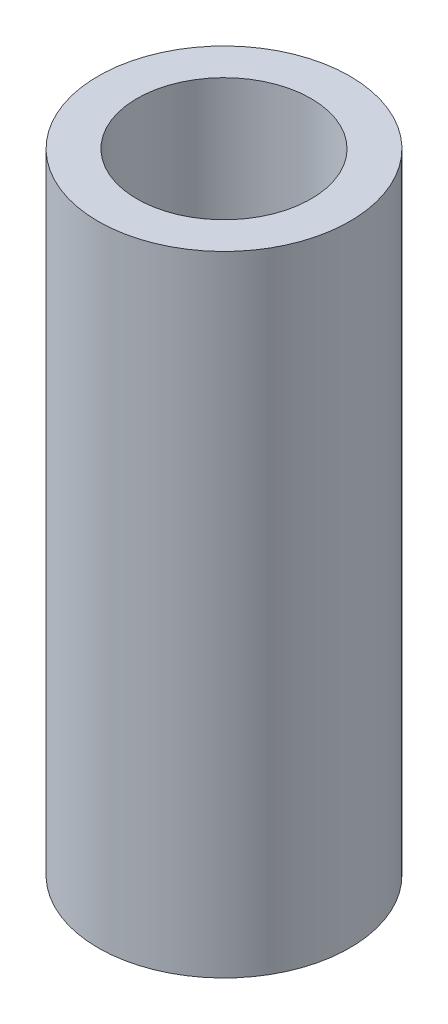
ISO-10303-21;
HEADER;
FILE_DESCRIPTION(('STEP AP214'),'2;1');
FILE_NAME('part.step','',(''),(''),'','','');
FILE_SCHEMA(('AUTOMOTIVE_DESIGN { 1 0 10303 214 1 1 1 1 }'));
ENDSEC;
DATA;
#1=APPLICATION_CONTEXT('core data for automotive mechanical design processes');
#2=APPLICATION_PROTOCOL_DEFINITION('international standard','automotive_design',2000,#1);
#3=PRODUCT_CONTEXT('',#1,'mechanical');
#4=PRODUCT('Part','Part','',(#3));
#5=PRODUCT_RELATED_PRODUCT_CATEGORY('part','',(#4));
#6=PRODUCT_DEFINITION_FORMATION('','',#4);
#7=PRODUCT_DEFINITION_CONTEXT('part definition',#1,'design');
#8=PRODUCT_DEFINITION('design','',#6,#7);
#9=PRODUCT_DEFINITION_SHAPE('','',#8);
#10=(LENGTH_UNIT() NAMED_UNIT(*) SI_UNIT(.MILLI.,.METRE.));
#11=(NAMED_UNIT(*) PLANE_ANGLE_UNIT() SI_UNIT($,.RADIAN.));
#12=(NAMED_UNIT(*) SI_UNIT($,.STERADIAN.) SOLID_ANGLE_UNIT());
#13=UNCERTAINTY_MEASURE_WITH_UNIT(LENGTH_MEASURE(1.E-05),#10,'distance_accuracy_value','');
#14=(GEOMETRIC_REPRESENTATION_CONTEXT(3) GLOBAL_UNCERTAINTY_ASSIGNED_CONTEXT((#13)) GLOBAL_UNIT_ASSIGNED_CONTEXT((#10,
#11,#12)) REPRESENTATION_CONTEXT('',''));
#15=CARTESIAN_POINT('',(0.,0.,0.));
#16=DIRECTION('',(0.,0.,1.));
#17=DIRECTION('',(1.,0.,0.));
#18=AXIS2_PLACEMENT_3D('',#15,#16,#17);
#19=CARTESIAN_POINT('',(0.,30.,0.));
#20=DIRECTION('',(0.,-1.,0.));
#21=DIRECTION('',(0.,0.,-1.));
#22=AXIS2_PLACEMENT_3D('',#19,#20,#21);
#23=CYLINDRICAL_SURFACE('',#22,4.15);
#24=CARTESIAN_POINT('',(0.,0.,0.));
#25=DIRECTION('',(0.,-1.,0.));
#26=DIRECTION('',(0.,0.,-1.));
#27=AXIS2_PLACEMENT_3D('',#24,#25,#26);
#28=CIRCLE('',#27,4.15);
#29=CARTESIAN_POINT('',(0.,0.,-4.15));
#30=VERTEX_POINT('',#29);
#31=EDGE_CURVE('E31',#30,#30,#28,.T.);
#32=ORIENTED_EDGE('',*,*,#31,.T.);
#33=EDGE_LOOP('',(#32));
#34=FACE_BOUND('',#33,.T.);
#35=CARTESIAN_POINT('',(0.,30.,0.));
#36=DIRECTION('',(0.,-1.,0.));
#37=DIRECTION('',(0.,0.,-1.));
#38=AXIS2_PLACEMENT_3D('',#35,#36,#37);
#39=CIRCLE('',#38,4.15);
#40=CARTESIAN_POINT('',(0.,30.,-4.15));
#41=VERTEX_POINT('',#40);
#42=EDGE_CURVE('E40',#41,#41,#39,.T.);
#43=ORIENTED_EDGE('',*,*,#42,.F.);
#44=EDGE_LOOP('',(#43));
#45=FACE_BOUND('',#44,.T.);
#46=ADVANCED_FACE('F15',(#34,#45),#23,.F.);
#47=CARTESIAN_POINT('',(0.,30.,0.));
#48=DIRECTION('',(0.,1.,0.));
#49=DIRECTION('',(0.,0.,1.));
#50=AXIS2_PLACEMENT_3D('',#47,#48,#49);
#51=PLANE('',#50);
#52=ORIENTED_EDGE('',*,*,#42,.T.);
#53=EDGE_LOOP('',(#52));
#54=FACE_BOUND('',#53,.T.);
#55=CARTESIAN_POINT('',(0.,30.,0.));
#56=DIRECTION('',(0.,-1.,0.));
#57=DIRECTION('',(0.,0.,-1.));
#58=AXIS2_PLACEMENT_3D('',#55,#56,#57);
#59=CIRCLE('',#58,6.);
#60=CARTESIAN_POINT('',(0.,30.,-6.));
#61=VERTEX_POINT('',#60);
#62=EDGE_CURVE('E23',#61,#61,#59,.T.);
#63=ORIENTED_EDGE('',*,*,#62,.F.);
#64=EDGE_LOOP('',(#63));
#65=FACE_BOUND('',#64,.T.);
#66=ADVANCED_FACE('F46',(#54,#65),#51,.T.);
#67=CARTESIAN_POINT('',(0.,0.,0.));
#68=DIRECTION('',(0.,1.,0.));
#69=DIRECTION('',(0.,0.,1.));
#70=AXIS2_PLACEMENT_3D('',#67,#68,#69);
#71=PLANE('',#70);
#72=ORIENTED_EDGE('',*,*,#31,.F.);
#73=EDGE_LOOP('',(#72));
#74=FACE_BOUND('',#73,.T.);
#75=CARTESIAN_POINT('',(0.,0.,0.));
#76=DIRECTION('',(0.,-1.,0.));
#77=DIRECTION('',(0.,0.,-1.));
#78=AXIS2_PLACEMENT_3D('',#75,#76,#77);
#79=CIRCLE('',#78,6.);
#80=CARTESIAN_POINT('',(0.,0.,-6.));
#81=VERTEX_POINT('',#80);
#82=EDGE_CURVE('E10',#81,#81,#79,.F.);
#83=ORIENTED_EDGE('',*,*,#82,.F.);
#84=EDGE_LOOP('',(#83));
#85=FACE_BOUND('',#84,.T.);
#86=ADVANCED_FACE('F55',(#74,#85),#71,.F.);
#87=CARTESIAN_POINT('',(0.,30.,0.));
#88=DIRECTION('',(0.,-1.,0.));
#89=DIRECTION('',(0.,0.,-1.));
#90=AXIS2_PLACEMENT_3D('',#87,#88,#89);
#91=CYLINDRICAL_SURFACE('',#90,6.);
#92=ORIENTED_EDGE('',*,*,#82,.T.);
#93=EDGE_LOOP('',(#92));
#94=FACE_BOUND('',#93,.T.);
#95=ORIENTED_EDGE('',*,*,#62,.T.);
#96=EDGE_LOOP('',(#95));
#97=FACE_BOUND('',#96,.T.);
#98=ADVANCED_FACE('F56',(#94,#97),#91,.T.);
#99=CLOSED_SHELL('',(#46,#66,#86,#98));
#100=MANIFOLD_SOLID_BREP('B1',#99);
#101=ADVANCED_BREP_SHAPE_REPRESENTATION('',(#18,#100),#14);
#102=SHAPE_DEFINITION_REPRESENTATION(#9,#101);
ENDSEC;
END-ISO-10303-21;
